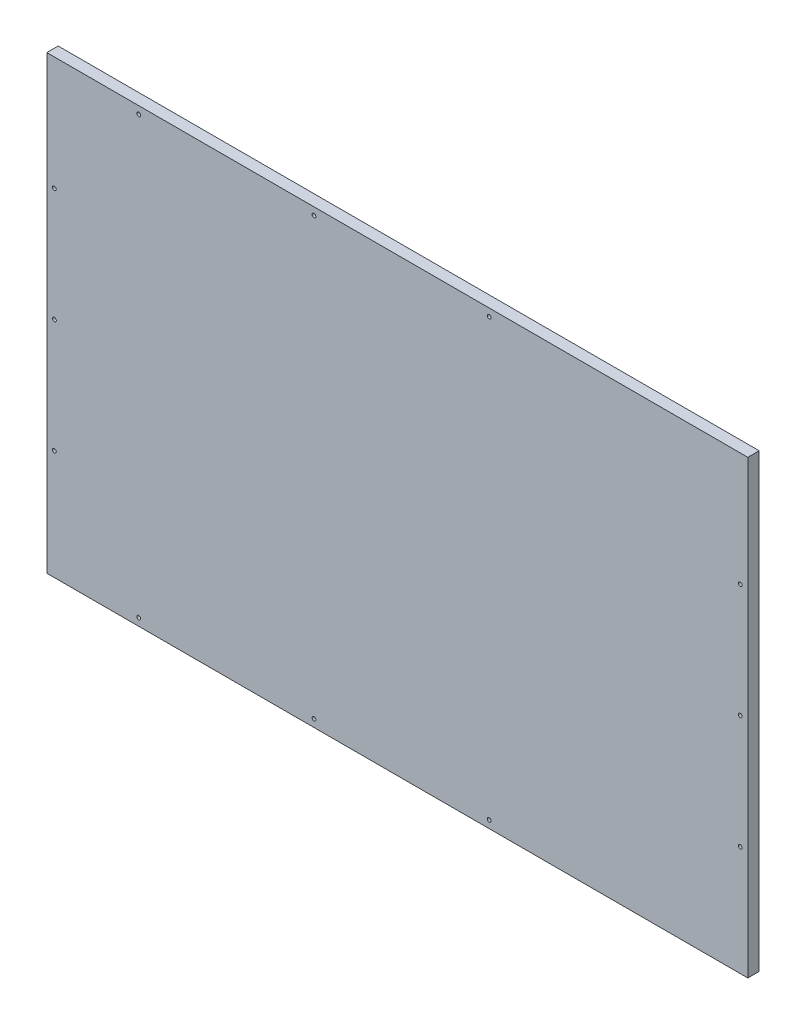
ISO-10303-21;
HEADER;
FILE_DESCRIPTION(('STEP AP214'),'2;1');
FILE_NAME('part.step','',(''),(''),'','','');
FILE_SCHEMA(('AUTOMOTIVE_DESIGN { 1 0 10303 214 1 1 1 1 }'));
ENDSEC;
DATA;
#1=APPLICATION_CONTEXT('core data for automotive mechanical design processes');
#2=APPLICATION_PROTOCOL_DEFINITION('international standard','automotive_design',2000,#1);
#3=PRODUCT_CONTEXT('',#1,'mechanical');
#4=PRODUCT('Part','Part','',(#3));
#5=PRODUCT_RELATED_PRODUCT_CATEGORY('part','',(#4));
#6=PRODUCT_DEFINITION_FORMATION('','',#4);
#7=PRODUCT_DEFINITION_CONTEXT('part definition',#1,'design');
#8=PRODUCT_DEFINITION('design','',#6,#7);
#9=PRODUCT_DEFINITION_SHAPE('','',#8);
#10=(LENGTH_UNIT() NAMED_UNIT(*) SI_UNIT(.MILLI.,.METRE.));
#11=(NAMED_UNIT(*) PLANE_ANGLE_UNIT() SI_UNIT($,.RADIAN.));
#12=(NAMED_UNIT(*) SI_UNIT($,.STERADIAN.) SOLID_ANGLE_UNIT());
#13=UNCERTAINTY_MEASURE_WITH_UNIT(LENGTH_MEASURE(1.E-05),#10,'distance_accuracy_value','');
#14=(GEOMETRIC_REPRESENTATION_CONTEXT(3) GLOBAL_UNCERTAINTY_ASSIGNED_CONTEXT((#13)) GLOBAL_UNIT_ASSIGNED_CONTEXT((#10,
#11,#12)) REPRESENTATION_CONTEXT('',''));
#15=CARTESIAN_POINT('',(0.,0.,0.));
#16=DIRECTION('',(0.,0.,1.));
#17=DIRECTION('',(1.,0.,0.));
#18=AXIS2_PLACEMENT_3D('',#15,#16,#17);
#19=CARTESIAN_POINT('',(462.5,297.5,15.));
#20=DIRECTION('',(-1.,0.,0.));
#21=DIRECTION('',(0.,0.,1.));
#22=AXIS2_PLACEMENT_3D('',#19,#20,#21);
#23=PLANE('',#22);
#24=DIRECTION('',(0.,1.,0.));
#25=VECTOR('',#24,1.);
#26=CARTESIAN_POINT('',(462.5,297.5,0.));
#27=LINE('',#26,#25);
#28=CARTESIAN_POINT('',(462.5,-297.5,0.));
#29=VERTEX_POINT('',#28);
#30=CARTESIAN_POINT('',(462.5,297.5,0.));
#31=VERTEX_POINT('',#30);
#32=EDGE_CURVE('E100',#29,#31,#27,.T.);
#33=ORIENTED_EDGE('',*,*,#32,.T.);
#34=DIRECTION('',(0.,0.,-1.));
#35=VECTOR('',#34,1.);
#36=CARTESIAN_POINT('',(462.5,297.5,15.));
#37=LINE('',#36,#35);
#38=CARTESIAN_POINT('',(462.5,297.5,15.));
#39=VERTEX_POINT('',#38);
#40=EDGE_CURVE('E11',#39,#31,#37,.T.);
#41=ORIENTED_EDGE('',*,*,#40,.F.);
#42=DIRECTION('',(0.,1.,0.));
#43=VECTOR('',#42,1.);
#44=CARTESIAN_POINT('',(462.5,297.5,15.));
#45=LINE('',#44,#43);
#46=CARTESIAN_POINT('',(462.5,-297.5,15.));
#47=VERTEX_POINT('',#46);
#48=EDGE_CURVE('E88',#47,#39,#45,.T.);
#49=ORIENTED_EDGE('',*,*,#48,.F.);
#50=DIRECTION('',(0.,0.,-1.));
#51=VECTOR('',#50,1.);
#52=CARTESIAN_POINT('',(462.5,-297.5,15.));
#53=LINE('',#52,#51);
#54=EDGE_CURVE('E96',#47,#29,#53,.T.);
#55=ORIENTED_EDGE('',*,*,#54,.T.);
#56=EDGE_LOOP('',(#33,#41,#49,#55));
#57=FACE_BOUND('',#56,.T.);
#58=ADVANCED_FACE('F37',(#57),#23,.F.);
#59=CARTESIAN_POINT('',(-462.5,297.5,15.));
#60=DIRECTION('',(0.,-1.,0.));
#61=DIRECTION('',(0.,0.,-1.));
#62=AXIS2_PLACEMENT_3D('',#59,#60,#61);
#63=PLANE('',#62);
#64=DIRECTION('',(-1.,0.,0.));
#65=VECTOR('',#64,1.);
#66=CARTESIAN_POINT('',(-462.5,297.5,0.));
#67=LINE('',#66,#65);
#68=CARTESIAN_POINT('',(-462.5,297.5,0.));
#69=VERTEX_POINT('',#68);
#70=EDGE_CURVE('E92',#31,#69,#67,.T.);
#71=ORIENTED_EDGE('',*,*,#70,.T.);
#72=DIRECTION('',(0.,0.,-1.));
#73=VECTOR('',#72,1.);
#74=CARTESIAN_POINT('',(-462.5,297.5,15.));
#75=LINE('',#74,#73);
#76=CARTESIAN_POINT('',(-462.5,297.5,15.));
#77=VERTEX_POINT('',#76);
#78=EDGE_CURVE('E45',#77,#69,#75,.T.);
#79=ORIENTED_EDGE('',*,*,#78,.F.);
#80=DIRECTION('',(-1.,0.,0.));
#81=VECTOR('',#80,1.);
#82=CARTESIAN_POINT('',(-462.5,297.5,15.));
#83=LINE('',#82,#81);
#84=EDGE_CURVE('E83',#39,#77,#83,.T.);
#85=ORIENTED_EDGE('',*,*,#84,.F.);
#86=ORIENTED_EDGE('',*,*,#40,.T.);
#87=EDGE_LOOP('',(#71,#79,#85,#86));
#88=FACE_BOUND('',#87,.T.);
#89=ADVANCED_FACE('F91',(#88),#63,.F.);
#90=CARTESIAN_POINT('',(-462.5,297.5,15.));
#91=DIRECTION('',(1.,0.,0.));
#92=DIRECTION('',(0.,1.,0.));
#93=AXIS2_PLACEMENT_3D('',#90,#91,#92);
#94=PLANE('',#93);
#95=DIRECTION('',(0.,-1.,0.));
#96=VECTOR('',#95,1.);
#97=CARTESIAN_POINT('',(-462.5,297.5,0.));
#98=LINE('',#97,#96);
#99=CARTESIAN_POINT('',(-462.5,-297.5,0.));
#100=VERTEX_POINT('',#99);
#101=EDGE_CURVE('E70',#69,#100,#98,.T.);
#102=ORIENTED_EDGE('',*,*,#101,.T.);
#103=DIRECTION('',(0.,0.,-1.));
#104=VECTOR('',#103,1.);
#105=CARTESIAN_POINT('',(-462.5,-297.5,15.));
#106=LINE('',#105,#104);
#107=CARTESIAN_POINT('',(-462.5,-297.5,15.));
#108=VERTEX_POINT('',#107);
#109=EDGE_CURVE('E93',#108,#100,#106,.T.);
#110=ORIENTED_EDGE('',*,*,#109,.F.);
#111=DIRECTION('',(0.,-1.,0.));
#112=VECTOR('',#111,1.);
#113=CARTESIAN_POINT('',(-462.5,297.5,15.));
#114=LINE('',#113,#112);
#115=EDGE_CURVE('E86',#77,#108,#114,.T.);
#116=ORIENTED_EDGE('',*,*,#115,.F.);
#117=ORIENTED_EDGE('',*,*,#78,.T.);
#118=EDGE_LOOP('',(#102,#110,#116,#117));
#119=FACE_BOUND('',#118,.T.);
#120=ADVANCED_FACE('F94',(#119),#94,.F.);
#121=CARTESIAN_POINT('',(-462.5,-297.5,15.));
#122=DIRECTION('',(0.,1.,0.));
#123=DIRECTION('',(0.,0.,1.));
#124=AXIS2_PLACEMENT_3D('',#121,#122,#123);
#125=PLANE('',#124);
#126=DIRECTION('',(1.,0.,0.));
#127=VECTOR('',#126,1.);
#128=CARTESIAN_POINT('',(-462.5,-297.5,0.));
#129=LINE('',#128,#127);
#130=EDGE_CURVE('E76',#100,#29,#129,.T.);
#131=ORIENTED_EDGE('',*,*,#130,.T.);
#132=ORIENTED_EDGE('',*,*,#54,.F.);
#133=DIRECTION('',(1.,0.,0.));
#134=VECTOR('',#133,1.);
#135=CARTESIAN_POINT('',(-462.5,-297.5,15.));
#136=LINE('',#135,#134);
#137=EDGE_CURVE('E53',#108,#47,#136,.T.);
#138=ORIENTED_EDGE('',*,*,#137,.F.);
#139=ORIENTED_EDGE('',*,*,#109,.T.);
#140=EDGE_LOOP('',(#131,#132,#138,#139));
#141=FACE_BOUND('',#140,.T.);
#142=ADVANCED_FACE('F108',(#141),#125,.F.);
#143=CARTESIAN_POINT('',(0.,0.,15.));
#144=DIRECTION('',(0.,0.,1.));
#145=DIRECTION('',(1.,0.,0.));
#146=AXIS2_PLACEMENT_3D('',#143,#144,#145);
#147=PLANE('',#146);
#148=CARTESIAN_POINT('',(452.5,147.5,15.));
#149=DIRECTION('',(0.,0.,-1.));
#150=DIRECTION('',(-1.,0.,0.));
#151=AXIS2_PLACEMENT_3D('',#148,#149,#150);
#152=CIRCLE('',#151,2.50000000000002);
#153=CARTESIAN_POINT('',(450.,147.5,15.));
#154=VERTEX_POINT('',#153);
#155=EDGE_CURVE('E180',#154,#154,#152,.T.);
#156=ORIENTED_EDGE('',*,*,#155,.T.);
#157=EDGE_LOOP('',(#156));
#158=FACE_BOUND('',#157,.T.);
#159=CARTESIAN_POINT('',(452.5,-2.5,15.));
#160=DIRECTION('',(0.,0.,-1.));
#161=DIRECTION('',(-1.,0.,0.));
#162=AXIS2_PLACEMENT_3D('',#159,#160,#161);
#163=CIRCLE('',#162,2.50000000000002);
#164=CARTESIAN_POINT('',(450.,-2.5,15.));
#165=VERTEX_POINT('',#164);
#166=EDGE_CURVE('E174',#165,#165,#163,.T.);
#167=ORIENTED_EDGE('',*,*,#166,.T.);
#168=EDGE_LOOP('',(#167));
#169=FACE_BOUND('',#168,.T.);
#170=CARTESIAN_POINT('',(452.5,-152.5,15.));
#171=DIRECTION('',(0.,0.,-1.));
#172=DIRECTION('',(-1.,0.,0.));
#173=AXIS2_PLACEMENT_3D('',#170,#171,#172);
#174=CIRCLE('',#173,2.50000000000002);
#175=CARTESIAN_POINT('',(450.,-152.5,15.));
#176=VERTEX_POINT('',#175);
#177=EDGE_CURVE('E168',#176,#176,#174,.T.);
#178=ORIENTED_EDGE('',*,*,#177,.T.);
#179=EDGE_LOOP('',(#178));
#180=FACE_BOUND('',#179,.T.);
#181=CARTESIAN_POINT('',(-341.25,-287.5,15.));
#182=DIRECTION('',(0.,0.,-1.));
#183=DIRECTION('',(1.,0.,0.));
#184=AXIS2_PLACEMENT_3D('',#181,#182,#183);
#185=CIRCLE('',#184,2.50000000000002);
#186=CARTESIAN_POINT('',(-338.75,-287.5,15.));
#187=VERTEX_POINT('',#186);
#188=EDGE_CURVE('E163',#187,#187,#185,.T.);
#189=ORIENTED_EDGE('',*,*,#188,.T.);
#190=EDGE_LOOP('',(#189));
#191=FACE_BOUND('',#190,.T.);
#192=CARTESIAN_POINT('',(-110.,-287.5,15.));
#193=DIRECTION('',(0.,0.,-1.));
#194=DIRECTION('',(1.,0.,0.));
#195=AXIS2_PLACEMENT_3D('',#192,#193,#194);
#196=CIRCLE('',#195,2.49999999999993);
#197=CARTESIAN_POINT('',(-107.5,-287.5,15.));
#198=VERTEX_POINT('',#197);
#199=EDGE_CURVE('E157',#198,#198,#196,.T.);
#200=ORIENTED_EDGE('',*,*,#199,.T.);
#201=EDGE_LOOP('',(#200));
#202=FACE_BOUND('',#201,.T.);
#203=CARTESIAN_POINT('',(121.25,-287.5,15.));
#204=DIRECTION('',(0.,0.,-1.));
#205=DIRECTION('',(1.,0.,0.));
#206=AXIS2_PLACEMENT_3D('',#203,#204,#205);
#207=CIRCLE('',#206,2.4999999999999);
#208=CARTESIAN_POINT('',(123.75,-287.5,15.));
#209=VERTEX_POINT('',#208);
#210=EDGE_CURVE('E150',#209,#209,#207,.T.);
#211=ORIENTED_EDGE('',*,*,#210,.T.);
#212=EDGE_LOOP('',(#211));
#213=FACE_BOUND('',#212,.T.);
#214=CARTESIAN_POINT('',(-452.5,147.5,15.));
#215=DIRECTION('',(0.,0.,1.));
#216=DIRECTION('',(1.,0.,0.));
#217=AXIS2_PLACEMENT_3D('',#214,#215,#216);
#218=CIRCLE('',#217,2.50000000000002);
#219=CARTESIAN_POINT('',(-450.,147.5,15.));
#220=VERTEX_POINT('',#219);
#221=EDGE_CURVE('E145',#220,#220,#218,.T.);
#222=ORIENTED_EDGE('',*,*,#221,.F.);
#223=EDGE_LOOP('',(#222));
#224=FACE_BOUND('',#223,.T.);
#225=CARTESIAN_POINT('',(-452.5,-2.5,15.));
#226=DIRECTION('',(0.,0.,1.));
#227=DIRECTION('',(1.,0.,0.));
#228=AXIS2_PLACEMENT_3D('',#225,#226,#227);
#229=CIRCLE('',#228,2.50000000000002);
#230=CARTESIAN_POINT('',(-450.,-2.5,15.));
#231=VERTEX_POINT('',#230);
#232=EDGE_CURVE('E142',#231,#231,#229,.T.);
#233=ORIENTED_EDGE('',*,*,#232,.F.);
#234=EDGE_LOOP('',(#233));
#235=FACE_BOUND('',#234,.T.);
#236=CARTESIAN_POINT('',(-452.5,-152.5,15.));
#237=DIRECTION('',(0.,0.,1.));
#238=DIRECTION('',(1.,0.,0.));
#239=AXIS2_PLACEMENT_3D('',#236,#237,#238);
#240=CIRCLE('',#239,2.50000000000002);
#241=CARTESIAN_POINT('',(-450.,-152.5,15.));
#242=VERTEX_POINT('',#241);
#243=EDGE_CURVE('E135',#242,#242,#240,.T.);
#244=ORIENTED_EDGE('',*,*,#243,.F.);
#245=EDGE_LOOP('',(#244));
#246=FACE_BOUND('',#245,.T.);
#247=CARTESIAN_POINT('',(-341.25,287.5,15.));
#248=DIRECTION('',(0.,0.,1.));
#249=DIRECTION('',(1.,0.,0.));
#250=AXIS2_PLACEMENT_3D('',#247,#248,#249);
#251=CIRCLE('',#250,2.50000000000002);
#252=CARTESIAN_POINT('',(-338.75,287.5,15.));
#253=VERTEX_POINT('',#252);
#254=EDGE_CURVE('E127',#253,#253,#251,.T.);
#255=ORIENTED_EDGE('',*,*,#254,.F.);
#256=EDGE_LOOP('',(#255));
#257=FACE_BOUND('',#256,.T.);
#258=CARTESIAN_POINT('',(-110.,287.5,15.));
#259=DIRECTION('',(0.,0.,1.));
#260=DIRECTION('',(1.,0.,0.));
#261=AXIS2_PLACEMENT_3D('',#258,#259,#260);
#262=CIRCLE('',#261,2.49999999999993);
#263=CARTESIAN_POINT('',(-107.5,287.5,15.));
#264=VERTEX_POINT('',#263);
#265=EDGE_CURVE('E124',#264,#264,#262,.T.);
#266=ORIENTED_EDGE('',*,*,#265,.F.);
#267=EDGE_LOOP('',(#266));
#268=FACE_BOUND('',#267,.T.);
#269=CARTESIAN_POINT('',(121.25,287.5,15.));
#270=DIRECTION('',(0.,0.,1.));
#271=DIRECTION('',(1.,0.,0.));
#272=AXIS2_PLACEMENT_3D('',#269,#270,#271);
#273=CIRCLE('',#272,2.4999999999999);
#274=CARTESIAN_POINT('',(123.75,287.5,15.));
#275=VERTEX_POINT('',#274);
#276=EDGE_CURVE('E117',#275,#275,#273,.T.);
#277=ORIENTED_EDGE('',*,*,#276,.F.);
#278=EDGE_LOOP('',(#277));
#279=FACE_BOUND('',#278,.T.);
#280=ORIENTED_EDGE('',*,*,#48,.T.);
#281=ORIENTED_EDGE('',*,*,#84,.T.);
#282=ORIENTED_EDGE('',*,*,#115,.T.);
#283=ORIENTED_EDGE('',*,*,#137,.T.);
#284=EDGE_LOOP('',(#280,#281,#282,#283));
#285=FACE_BOUND('',#284,.T.);
#286=ADVANCED_FACE('F84',(#158,#169,#180,#191,#202,#213,#224,#235,#246,#257,#268,#279,#285),
#147,.T.);
#287=CARTESIAN_POINT('',(0.,0.,0.));
#288=DIRECTION('',(0.,0.,1.));
#289=DIRECTION('',(1.,0.,0.));
#290=AXIS2_PLACEMENT_3D('',#287,#288,#289);
#291=PLANE('',#290);
#292=CARTESIAN_POINT('',(452.5,147.5,0.));
#293=DIRECTION('',(0.,0.,-1.));
#294=DIRECTION('',(-1.,0.,0.));
#295=AXIS2_PLACEMENT_3D('',#292,#293,#294);
#296=CIRCLE('',#295,2.50000000000002);
#297=CARTESIAN_POINT('',(450.,147.5,0.));
#298=VERTEX_POINT('',#297);
#299=EDGE_CURVE('E154',#298,#298,#296,.T.);
#300=ORIENTED_EDGE('',*,*,#299,.F.);
#301=EDGE_LOOP('',(#300));
#302=FACE_BOUND('',#301,.T.);
#303=CARTESIAN_POINT('',(452.5,-2.5,0.));
#304=DIRECTION('',(0.,0.,-1.));
#305=DIRECTION('',(-1.,0.,0.));
#306=AXIS2_PLACEMENT_3D('',#303,#304,#305);
#307=CIRCLE('',#306,2.50000000000002);
#308=CARTESIAN_POINT('',(450.,-2.5,0.));
#309=VERTEX_POINT('',#308);
#310=EDGE_CURVE('E177',#309,#309,#307,.T.);
#311=ORIENTED_EDGE('',*,*,#310,.F.);
#312=EDGE_LOOP('',(#311));
#313=FACE_BOUND('',#312,.T.);
#314=CARTESIAN_POINT('',(452.5,-152.5,0.));
#315=DIRECTION('',(0.,0.,-1.));
#316=DIRECTION('',(-1.,0.,0.));
#317=AXIS2_PLACEMENT_3D('',#314,#315,#316);
#318=CIRCLE('',#317,2.50000000000002);
#319=CARTESIAN_POINT('',(450.,-152.5,0.));
#320=VERTEX_POINT('',#319);
#321=EDGE_CURVE('E171',#320,#320,#318,.T.);
#322=ORIENTED_EDGE('',*,*,#321,.F.);
#323=EDGE_LOOP('',(#322));
#324=FACE_BOUND('',#323,.T.);
#325=CARTESIAN_POINT('',(-341.25,-287.5,0.));
#326=DIRECTION('',(0.,0.,-1.));
#327=DIRECTION('',(1.,0.,0.));
#328=AXIS2_PLACEMENT_3D('',#325,#326,#327);
#329=CIRCLE('',#328,2.50000000000002);
#330=CARTESIAN_POINT('',(-338.75,-287.5,0.));
#331=VERTEX_POINT('',#330);
#332=EDGE_CURVE('E136',#331,#331,#329,.T.);
#333=ORIENTED_EDGE('',*,*,#332,.F.);
#334=EDGE_LOOP('',(#333));
#335=FACE_BOUND('',#334,.T.);
#336=CARTESIAN_POINT('',(-110.,-287.5,0.));
#337=DIRECTION('',(0.,0.,-1.));
#338=DIRECTION('',(1.,0.,0.));
#339=AXIS2_PLACEMENT_3D('',#336,#337,#338);
#340=CIRCLE('',#339,2.49999999999993);
#341=CARTESIAN_POINT('',(-107.5,-287.5,0.));
#342=VERTEX_POINT('',#341);
#343=EDGE_CURVE('E160',#342,#342,#340,.T.);
#344=ORIENTED_EDGE('',*,*,#343,.F.);
#345=EDGE_LOOP('',(#344));
#346=FACE_BOUND('',#345,.T.);
#347=CARTESIAN_POINT('',(121.25,-287.5,0.));
#348=DIRECTION('',(0.,0.,-1.));
#349=DIRECTION('',(1.,0.,0.));
#350=AXIS2_PLACEMENT_3D('',#347,#348,#349);
#351=CIRCLE('',#350,2.4999999999999);
#352=CARTESIAN_POINT('',(123.75,-287.5,0.));
#353=VERTEX_POINT('',#352);
#354=EDGE_CURVE('E153',#353,#353,#351,.T.);
#355=ORIENTED_EDGE('',*,*,#354,.F.);
#356=EDGE_LOOP('',(#355));
#357=FACE_BOUND('',#356,.T.);
#358=CARTESIAN_POINT('',(-452.5,147.5,0.));
#359=DIRECTION('',(0.,0.,1.));
#360=DIRECTION('',(1.,0.,0.));
#361=AXIS2_PLACEMENT_3D('',#358,#359,#360);
#362=CIRCLE('',#361,2.50000000000002);
#363=CARTESIAN_POINT('',(-450.,147.5,0.));
#364=VERTEX_POINT('',#363);
#365=EDGE_CURVE('E118',#364,#364,#362,.T.);
#366=ORIENTED_EDGE('',*,*,#365,.T.);
#367=EDGE_LOOP('',(#366));
#368=FACE_BOUND('',#367,.T.);
#369=CARTESIAN_POINT('',(-452.5,-2.5,0.));
#370=DIRECTION('',(0.,0.,1.));
#371=DIRECTION('',(1.,0.,0.));
#372=AXIS2_PLACEMENT_3D('',#369,#370,#371);
#373=CIRCLE('',#372,2.50000000000002);
#374=CARTESIAN_POINT('',(-450.,-2.5,0.));
#375=VERTEX_POINT('',#374);
#376=EDGE_CURVE('E139',#375,#375,#373,.T.);
#377=ORIENTED_EDGE('',*,*,#376,.T.);
#378=EDGE_LOOP('',(#377));
#379=FACE_BOUND('',#378,.T.);
#380=CARTESIAN_POINT('',(-452.5,-152.5,0.));
#381=DIRECTION('',(0.,0.,1.));
#382=DIRECTION('',(1.,0.,0.));
#383=AXIS2_PLACEMENT_3D('',#380,#381,#382);
#384=CIRCLE('',#383,2.50000000000002);
#385=CARTESIAN_POINT('',(-450.,-152.5,0.));
#386=VERTEX_POINT('',#385);
#387=EDGE_CURVE('E132',#386,#386,#384,.T.);
#388=ORIENTED_EDGE('',*,*,#387,.T.);
#389=EDGE_LOOP('',(#388));
#390=FACE_BOUND('',#389,.T.);
#391=CARTESIAN_POINT('',(-341.25,287.5,0.));
#392=DIRECTION('',(0.,0.,1.));
#393=DIRECTION('',(1.,0.,0.));
#394=AXIS2_PLACEMENT_3D('',#391,#392,#393);
#395=CIRCLE('',#394,2.50000000000002);
#396=CARTESIAN_POINT('',(-338.75,287.5,0.));
#397=VERTEX_POINT('',#396);
#398=EDGE_CURVE('E103',#397,#397,#395,.T.);
#399=ORIENTED_EDGE('',*,*,#398,.T.);
#400=EDGE_LOOP('',(#399));
#401=FACE_BOUND('',#400,.T.);
#402=CARTESIAN_POINT('',(-110.,287.5,0.));
#403=DIRECTION('',(0.,0.,1.));
#404=DIRECTION('',(1.,0.,0.));
#405=AXIS2_PLACEMENT_3D('',#402,#403,#404);
#406=CIRCLE('',#405,2.49999999999993);
#407=CARTESIAN_POINT('',(-107.5,287.5,0.));
#408=VERTEX_POINT('',#407);
#409=EDGE_CURVE('E121',#408,#408,#406,.T.);
#410=ORIENTED_EDGE('',*,*,#409,.T.);
#411=EDGE_LOOP('',(#410));
#412=FACE_BOUND('',#411,.T.);
#413=CARTESIAN_POINT('',(121.25,287.5,0.));
#414=DIRECTION('',(0.,0.,1.));
#415=DIRECTION('',(1.,0.,0.));
#416=AXIS2_PLACEMENT_3D('',#413,#414,#415);
#417=CIRCLE('',#416,2.4999999999999);
#418=CARTESIAN_POINT('',(123.75,287.5,0.));
#419=VERTEX_POINT('',#418);
#420=EDGE_CURVE('E114',#419,#419,#417,.T.);
#421=ORIENTED_EDGE('',*,*,#420,.T.);
#422=EDGE_LOOP('',(#421));
#423=FACE_BOUND('',#422,.T.);
#424=ORIENTED_EDGE('',*,*,#32,.F.);
#425=ORIENTED_EDGE('',*,*,#130,.F.);
#426=ORIENTED_EDGE('',*,*,#101,.F.);
#427=ORIENTED_EDGE('',*,*,#70,.F.);
#428=EDGE_LOOP('',(#424,#425,#426,#427));
#429=FACE_BOUND('',#428,.T.);
#430=ADVANCED_FACE('F111',(#302,#313,#324,#335,#346,#357,#368,#379,#390,#401,#412,#423,#429),
#291,.F.);
#431=CARTESIAN_POINT('',(121.25,287.5,0.));
#432=DIRECTION('',(0.,0.,1.));
#433=DIRECTION('',(1.,0.,0.));
#434=AXIS2_PLACEMENT_3D('',#431,#432,#433);
#435=CYLINDRICAL_SURFACE('',#434,2.4999999999999);
#436=ORIENTED_EDGE('',*,*,#420,.F.);
#437=EDGE_LOOP('',(#436));
#438=FACE_BOUND('',#437,.T.);
#439=ORIENTED_EDGE('',*,*,#276,.T.);
#440=EDGE_LOOP('',(#439));
#441=FACE_BOUND('',#440,.T.);
#442=ADVANCED_FACE('F191',(#438,#441),#435,.F.);
#443=CARTESIAN_POINT('',(-110.,287.5,0.));
#444=DIRECTION('',(0.,0.,1.));
#445=DIRECTION('',(1.,0.,0.));
#446=AXIS2_PLACEMENT_3D('',#443,#444,#445);
#447=CYLINDRICAL_SURFACE('',#446,2.49999999999993);
#448=ORIENTED_EDGE('',*,*,#409,.F.);
#449=EDGE_LOOP('',(#448));
#450=FACE_BOUND('',#449,.T.);
#451=ORIENTED_EDGE('',*,*,#265,.T.);
#452=EDGE_LOOP('',(#451));
#453=FACE_BOUND('',#452,.T.);
#454=ADVANCED_FACE('F217',(#450,#453),#447,.F.);
#455=CARTESIAN_POINT('',(-341.25,287.5,0.));
#456=DIRECTION('',(0.,0.,1.));
#457=DIRECTION('',(1.,0.,0.));
#458=AXIS2_PLACEMENT_3D('',#455,#456,#457);
#459=CYLINDRICAL_SURFACE('',#458,2.50000000000002);
#460=ORIENTED_EDGE('',*,*,#398,.F.);
#461=EDGE_LOOP('',(#460));
#462=FACE_BOUND('',#461,.T.);
#463=ORIENTED_EDGE('',*,*,#254,.T.);
#464=EDGE_LOOP('',(#463));
#465=FACE_BOUND('',#464,.T.);
#466=ADVANCED_FACE('F262',(#462,#465),#459,.F.);
#467=CARTESIAN_POINT('',(-452.5,-152.5,0.));
#468=DIRECTION('',(0.,0.,1.));
#469=DIRECTION('',(1.,0.,0.));
#470=AXIS2_PLACEMENT_3D('',#467,#468,#469);
#471=CYLINDRICAL_SURFACE('',#470,2.50000000000002);
#472=ORIENTED_EDGE('',*,*,#387,.F.);
#473=EDGE_LOOP('',(#472));
#474=FACE_BOUND('',#473,.T.);
#475=ORIENTED_EDGE('',*,*,#243,.T.);
#476=EDGE_LOOP('',(#475));
#477=FACE_BOUND('',#476,.T.);
#478=ADVANCED_FACE('F273',(#474,#477),#471,.F.);
#479=CARTESIAN_POINT('',(-452.5,-2.5,0.));
#480=DIRECTION('',(0.,0.,1.));
#481=DIRECTION('',(1.,0.,0.));
#482=AXIS2_PLACEMENT_3D('',#479,#480,#481);
#483=CYLINDRICAL_SURFACE('',#482,2.50000000000002);
#484=ORIENTED_EDGE('',*,*,#376,.F.);
#485=EDGE_LOOP('',(#484));
#486=FACE_BOUND('',#485,.T.);
#487=ORIENTED_EDGE('',*,*,#232,.T.);
#488=EDGE_LOOP('',(#487));
#489=FACE_BOUND('',#488,.T.);
#490=ADVANCED_FACE('F284',(#486,#489),#483,.F.);
#491=CARTESIAN_POINT('',(-452.5,147.5,0.));
#492=DIRECTION('',(0.,0.,1.));
#493=DIRECTION('',(1.,0.,0.));
#494=AXIS2_PLACEMENT_3D('',#491,#492,#493);
#495=CYLINDRICAL_SURFACE('',#494,2.50000000000002);
#496=ORIENTED_EDGE('',*,*,#365,.F.);
#497=EDGE_LOOP('',(#496));
#498=FACE_BOUND('',#497,.T.);
#499=ORIENTED_EDGE('',*,*,#221,.T.);
#500=EDGE_LOOP('',(#499));
#501=FACE_BOUND('',#500,.T.);
#502=ADVANCED_FACE('F295',(#498,#501),#495,.F.);
#503=CARTESIAN_POINT('',(121.25,-287.5,0.));
#504=DIRECTION('',(0.,0.,1.));
#505=DIRECTION('',(1.,0.,0.));
#506=AXIS2_PLACEMENT_3D('',#503,#504,#505);
#507=CYLINDRICAL_SURFACE('',#506,2.4999999999999);
#508=ORIENTED_EDGE('',*,*,#354,.T.);
#509=EDGE_LOOP('',(#508));
#510=FACE_BOUND('',#509,.T.);
#511=ORIENTED_EDGE('',*,*,#210,.F.);
#512=EDGE_LOOP('',(#511));
#513=FACE_BOUND('',#512,.T.);
#514=ADVANCED_FACE('F306',(#510,#513),#507,.F.);
#515=CARTESIAN_POINT('',(-110.,-287.5,0.));
#516=DIRECTION('',(0.,0.,1.));
#517=DIRECTION('',(1.,0.,0.));
#518=AXIS2_PLACEMENT_3D('',#515,#516,#517);
#519=CYLINDRICAL_SURFACE('',#518,2.49999999999993);
#520=ORIENTED_EDGE('',*,*,#343,.T.);
#521=EDGE_LOOP('',(#520));
#522=FACE_BOUND('',#521,.T.);
#523=ORIENTED_EDGE('',*,*,#199,.F.);
#524=EDGE_LOOP('',(#523));
#525=FACE_BOUND('',#524,.T.);
#526=ADVANCED_FACE('F317',(#522,#525),#519,.F.);
#527=CARTESIAN_POINT('',(-341.25,-287.5,0.));
#528=DIRECTION('',(0.,0.,1.));
#529=DIRECTION('',(1.,0.,0.));
#530=AXIS2_PLACEMENT_3D('',#527,#528,#529);
#531=CYLINDRICAL_SURFACE('',#530,2.50000000000002);
#532=ORIENTED_EDGE('',*,*,#332,.T.);
#533=EDGE_LOOP('',(#532));
#534=FACE_BOUND('',#533,.T.);
#535=ORIENTED_EDGE('',*,*,#188,.F.);
#536=EDGE_LOOP('',(#535));
#537=FACE_BOUND('',#536,.T.);
#538=ADVANCED_FACE('F328',(#534,#537),#531,.F.);
#539=CARTESIAN_POINT('',(452.5,-152.5,0.));
#540=DIRECTION('',(0.,0.,1.));
#541=DIRECTION('',(1.,0.,0.));
#542=AXIS2_PLACEMENT_3D('',#539,#540,#541);
#543=CYLINDRICAL_SURFACE('',#542,2.50000000000002);
#544=ORIENTED_EDGE('',*,*,#321,.T.);
#545=EDGE_LOOP('',(#544));
#546=FACE_BOUND('',#545,.T.);
#547=ORIENTED_EDGE('',*,*,#177,.F.);
#548=EDGE_LOOP('',(#547));
#549=FACE_BOUND('',#548,.T.);
#550=ADVANCED_FACE('F338',(#546,#549),#543,.F.);
#551=CARTESIAN_POINT('',(452.5,-2.5,0.));
#552=DIRECTION('',(0.,0.,1.));
#553=DIRECTION('',(1.,0.,0.));
#554=AXIS2_PLACEMENT_3D('',#551,#552,#553);
#555=CYLINDRICAL_SURFACE('',#554,2.50000000000002);
#556=ORIENTED_EDGE('',*,*,#310,.T.);
#557=EDGE_LOOP('',(#556));
#558=FACE_BOUND('',#557,.T.);
#559=ORIENTED_EDGE('',*,*,#166,.F.);
#560=EDGE_LOOP('',(#559));
#561=FACE_BOUND('',#560,.T.);
#562=ADVANCED_FACE('F360',(#558,#561),#555,.F.);
#563=CARTESIAN_POINT('',(452.5,147.5,0.));
#564=DIRECTION('',(0.,0.,1.));
#565=DIRECTION('',(1.,0.,0.));
#566=AXIS2_PLACEMENT_3D('',#563,#564,#565);
#567=CYLINDRICAL_SURFACE('',#566,2.50000000000002);
#568=ORIENTED_EDGE('',*,*,#299,.T.);
#569=EDGE_LOOP('',(#568));
#570=FACE_BOUND('',#569,.T.);
#571=ORIENTED_EDGE('',*,*,#155,.F.);
#572=EDGE_LOOP('',(#571));
#573=FACE_BOUND('',#572,.T.);
#574=ADVANCED_FACE('F186',(#570,#573),#567,.F.);
#575=CLOSED_SHELL('',(#58,#89,#120,#142,#286,#430,#442,#454,#466,#478,#490,#502,#514,#526,#538,
#550,#562,#574));
#576=MANIFOLD_SOLID_BREP('B2',#575);
#577=ADVANCED_BREP_SHAPE_REPRESENTATION('',(#18,#576),#14);
#578=SHAPE_DEFINITION_REPRESENTATION(#9,#577);
ENDSEC;
END-ISO-10303-21;
